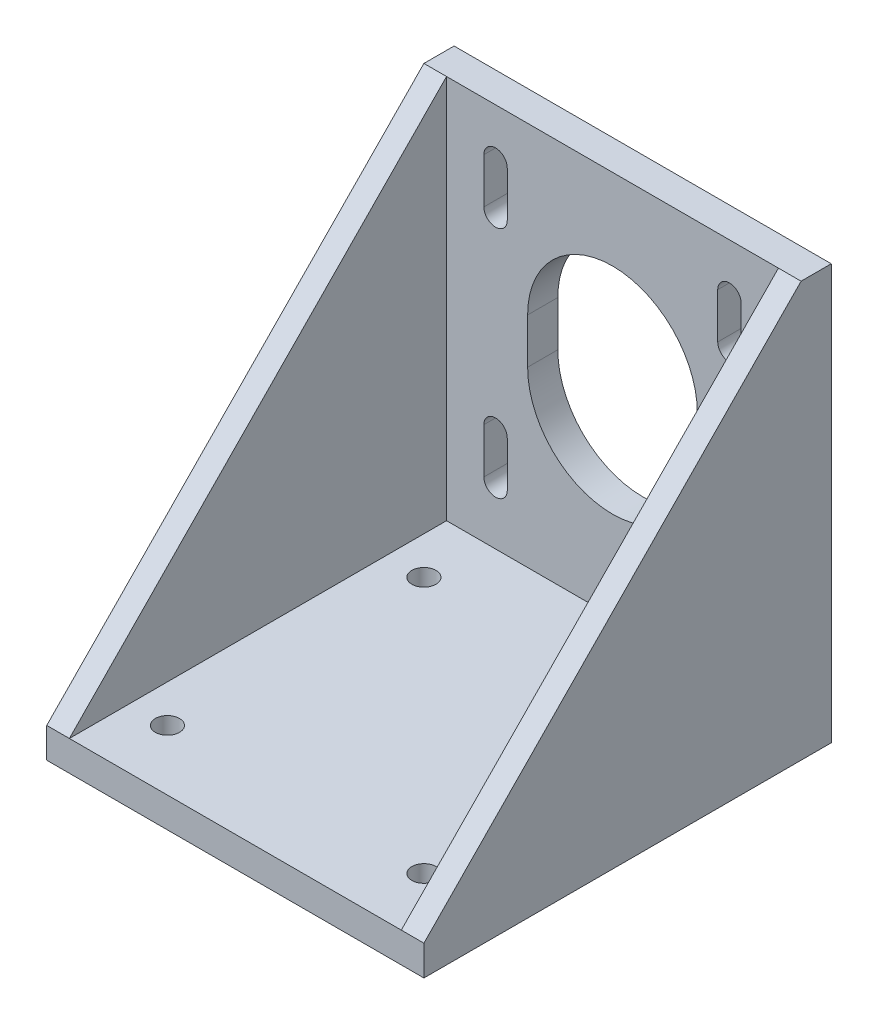
ISO-10303-21;
HEADER;
FILE_DESCRIPTION(('STEP AP214'),'2;1');
FILE_NAME('part.step','',(''),(''),'','','');
FILE_SCHEMA(('AUTOMOTIVE_DESIGN { 1 0 10303 214 1 1 1 1 }'));
ENDSEC;
DATA;
#1=APPLICATION_CONTEXT('core data for automotive mechanical design processes');
#2=APPLICATION_PROTOCOL_DEFINITION('international standard','automotive_design',2000,#1);
#3=PRODUCT_CONTEXT('',#1,'mechanical');
#4=PRODUCT('Part','Part','',(#3));
#5=PRODUCT_RELATED_PRODUCT_CATEGORY('part','',(#4));
#6=PRODUCT_DEFINITION_FORMATION('','',#4);
#7=PRODUCT_DEFINITION_CONTEXT('part definition',#1,'design');
#8=PRODUCT_DEFINITION('design','',#6,#7);
#9=PRODUCT_DEFINITION_SHAPE('','',#8);
#10=(LENGTH_UNIT() NAMED_UNIT(*) SI_UNIT(.MILLI.,.METRE.));
#11=(NAMED_UNIT(*) PLANE_ANGLE_UNIT() SI_UNIT($,.RADIAN.));
#12=(NAMED_UNIT(*) SI_UNIT($,.STERADIAN.) SOLID_ANGLE_UNIT());
#13=UNCERTAINTY_MEASURE_WITH_UNIT(LENGTH_MEASURE(1.E-05),#10,'distance_accuracy_value','');
#14=(GEOMETRIC_REPRESENTATION_CONTEXT(3) GLOBAL_UNCERTAINTY_ASSIGNED_CONTEXT((#13)) GLOBAL_UNIT_ASSIGNED_CONTEXT((#10,
#11,#12)) REPRESENTATION_CONTEXT('',''));
#15=CARTESIAN_POINT('',(0.,0.,0.));
#16=DIRECTION('',(0.,0.,1.));
#17=DIRECTION('',(1.,0.,0.));
#18=AXIS2_PLACEMENT_3D('',#15,#16,#17);
#19=CARTESIAN_POINT('',(0.,4.,0.));
#20=DIRECTION('',(0.,-1.,0.));
#21=DIRECTION('',(0.,0.,-1.));
#22=AXIS2_PLACEMENT_3D('',#19,#20,#21);
#23=PLANE('',#22);
#24=CARTESIAN_POINT('',(47.55,4.,-13.55));
#25=DIRECTION('',(0.,1.,0.));
#26=DIRECTION('',(0.,0.,1.));
#27=AXIS2_PLACEMENT_3D('',#24,#25,#26);
#28=CIRCLE('',#27,1.6);
#29=CARTESIAN_POINT('',(47.55,4.,-11.95));
#30=VERTEX_POINT('',#29);
#31=EDGE_CURVE('E450',#30,#30,#28,.T.);
#32=ORIENTED_EDGE('',*,*,#31,.F.);
#33=EDGE_LOOP('',(#32));
#34=FACE_BOUND('',#33,.T.);
#35=CARTESIAN_POINT('',(13.55,4.,-13.55));
#36=DIRECTION('',(0.,1.,0.));
#37=DIRECTION('',(0.,0.,1.));
#38=AXIS2_PLACEMENT_3D('',#35,#36,#37);
#39=CIRCLE('',#38,1.6);
#40=CARTESIAN_POINT('',(13.55,4.,-11.95));
#41=VERTEX_POINT('',#40);
#42=EDGE_CURVE('E456',#41,#41,#39,.T.);
#43=ORIENTED_EDGE('',*,*,#42,.F.);
#44=EDGE_LOOP('',(#43));
#45=FACE_BOUND('',#44,.T.);
#46=CARTESIAN_POINT('',(47.55,4.,-47.55));
#47=DIRECTION('',(0.,1.,0.));
#48=DIRECTION('',(0.,0.,1.));
#49=AXIS2_PLACEMENT_3D('',#46,#47,#48);
#50=CIRCLE('',#49,1.60000000000001);
#51=CARTESIAN_POINT('',(47.55,4.,-45.95));
#52=VERTEX_POINT('',#51);
#53=EDGE_CURVE('E462',#52,#52,#50,.T.);
#54=ORIENTED_EDGE('',*,*,#53,.F.);
#55=EDGE_LOOP('',(#54));
#56=FACE_BOUND('',#55,.T.);
#57=CARTESIAN_POINT('',(13.55,4.,-47.55));
#58=DIRECTION('',(0.,1.,0.));
#59=DIRECTION('',(0.,0.,1.));
#60=AXIS2_PLACEMENT_3D('',#57,#58,#59);
#61=CIRCLE('',#60,1.6);
#62=CARTESIAN_POINT('',(13.55,4.,-45.95));
#63=VERTEX_POINT('',#62);
#64=EDGE_CURVE('E255',#63,#63,#61,.T.);
#65=ORIENTED_EDGE('',*,*,#64,.F.);
#66=EDGE_LOOP('',(#65));
#67=FACE_BOUND('',#66,.T.);
#68=DIRECTION('',(0.,0.,1.));
#69=VECTOR('',#68,1.);
#70=CARTESIAN_POINT('',(8.55000000000001,4.,-5.54999999999999));
#71=LINE('',#70,#69);
#72=CARTESIAN_POINT('',(8.55,4.,-55.55));
#73=VERTEX_POINT('',#72);
#74=CARTESIAN_POINT('',(8.55000000000001,4.,-5.54999999999999));
#75=VERTEX_POINT('',#74);
#76=EDGE_CURVE('E221',#73,#75,#71,.T.);
#77=ORIENTED_EDGE('',*,*,#76,.T.);
#78=DIRECTION('',(1.,0.,0.));
#79=VECTOR('',#78,1.);
#80=CARTESIAN_POINT('',(5.55,4.,-5.54999999999999));
#81=LINE('',#80,#79);
#82=CARTESIAN_POINT('',(52.55,4.,-5.54999999999999));
#83=VERTEX_POINT('',#82);
#84=EDGE_CURVE('E244',#75,#83,#81,.T.);
#85=ORIENTED_EDGE('',*,*,#84,.T.);
#86=DIRECTION('',(0.,0.,-1.));
#87=VECTOR('',#86,1.);
#88=CARTESIAN_POINT('',(52.55,4.,-5.54999999999999));
#89=LINE('',#88,#87);
#90=CARTESIAN_POINT('',(52.55,4.,-55.55));
#91=VERTEX_POINT('',#90);
#92=EDGE_CURVE('E243',#83,#91,#89,.T.);
#93=ORIENTED_EDGE('',*,*,#92,.T.);
#94=DIRECTION('',(-1.,0.,0.));
#95=VECTOR('',#94,1.);
#96=CARTESIAN_POINT('',(5.55,4.,-55.55));
#97=LINE('',#96,#95);
#98=EDGE_CURVE('E236',#91,#73,#97,.T.);
#99=ORIENTED_EDGE('',*,*,#98,.T.);
#100=EDGE_LOOP('',(#77,#85,#93,#99));
#101=FACE_BOUND('',#100,.T.);
#102=ADVANCED_FACE('F35',(#34,#45,#56,#67,#101),#23,.F.);
#103=CARTESIAN_POINT('',(0.,0.,-55.55));
#104=DIRECTION('',(0.,0.,-1.));
#105=DIRECTION('',(-1.,0.,0.));
#106=AXIS2_PLACEMENT_3D('',#103,#104,#105);
#107=PLANE('',#106);
#108=CARTESIAN_POINT('',(30.55,33.,-55.55));
#109=DIRECTION('',(0.,0.,-1.));
#110=DIRECTION('',(-1.,0.,0.));
#111=AXIS2_PLACEMENT_3D('',#108,#109,#110);
#112=CIRCLE('',#111,11.25);
#113=CARTESIAN_POINT('',(19.3,33.,-55.55));
#114=VERTEX_POINT('',#113);
#115=CARTESIAN_POINT('',(41.8,33.,-55.55));
#116=VERTEX_POINT('',#115);
#117=EDGE_CURVE('E397',#114,#116,#112,.T.);
#118=ORIENTED_EDGE('',*,*,#117,.T.);
#119=DIRECTION('',(0.,-1.,0.));
#120=VECTOR('',#119,1.);
#121=CARTESIAN_POINT('',(41.8,0.,-55.55));
#122=LINE('',#121,#120);
#123=CARTESIAN_POINT('',(41.8,27.,-55.55));
#124=VERTEX_POINT('',#123);
#125=EDGE_CURVE('E280',#116,#124,#122,.T.);
#126=ORIENTED_EDGE('',*,*,#125,.T.);
#127=CARTESIAN_POINT('',(30.55,27.,-55.55));
#128=DIRECTION('',(0.,0.,-1.));
#129=DIRECTION('',(-1.,0.,0.));
#130=AXIS2_PLACEMENT_3D('',#127,#128,#129);
#131=CIRCLE('',#130,11.25);
#132=CARTESIAN_POINT('',(19.3,27.,-55.55));
#133=VERTEX_POINT('',#132);
#134=EDGE_CURVE('E283',#124,#133,#131,.T.);
#135=ORIENTED_EDGE('',*,*,#134,.T.);
#136=DIRECTION('',(0.,-1.,0.));
#137=VECTOR('',#136,1.);
#138=CARTESIAN_POINT('',(19.3,0.,-55.55));
#139=LINE('',#138,#137);
#140=EDGE_CURVE('E400',#114,#133,#139,.T.);
#141=ORIENTED_EDGE('',*,*,#140,.F.);
#142=EDGE_LOOP('',(#118,#126,#135,#141));
#143=FACE_BOUND('',#142,.T.);
#144=CARTESIAN_POINT('',(46.05,11.5,-55.55));
#145=DIRECTION('',(0.,0.,-1.));
#146=DIRECTION('',(-1.,0.,0.));
#147=AXIS2_PLACEMENT_3D('',#144,#145,#146);
#148=CIRCLE('',#147,1.55);
#149=CARTESIAN_POINT('',(47.6,11.5,-55.55));
#150=VERTEX_POINT('',#149);
#151=CARTESIAN_POINT('',(44.5,11.5,-55.55));
#152=VERTEX_POINT('',#151);
#153=EDGE_CURVE('E385',#150,#152,#148,.T.);
#154=ORIENTED_EDGE('',*,*,#153,.T.);
#155=DIRECTION('',(0.,-1.,0.));
#156=VECTOR('',#155,1.);
#157=CARTESIAN_POINT('',(44.5,0.,-55.55));
#158=LINE('',#157,#156);
#159=CARTESIAN_POINT('',(44.5,17.5,-55.55));
#160=VERTEX_POINT('',#159);
#161=EDGE_CURVE('E394',#160,#152,#158,.T.);
#162=ORIENTED_EDGE('',*,*,#161,.F.);
#163=CARTESIAN_POINT('',(46.05,17.5,-55.55));
#164=DIRECTION('',(0.,0.,-1.));
#165=DIRECTION('',(-1.,0.,0.));
#166=AXIS2_PLACEMENT_3D('',#163,#164,#165);
#167=CIRCLE('',#166,1.55);
#168=CARTESIAN_POINT('',(47.6,17.5,-55.55));
#169=VERTEX_POINT('',#168);
#170=EDGE_CURVE('E391',#160,#169,#167,.T.);
#171=ORIENTED_EDGE('',*,*,#170,.T.);
#172=DIRECTION('',(0.,-1.,0.));
#173=VECTOR('',#172,1.);
#174=CARTESIAN_POINT('',(47.6,0.,-55.55));
#175=LINE('',#174,#173);
#176=EDGE_CURVE('E388',#169,#150,#175,.T.);
#177=ORIENTED_EDGE('',*,*,#176,.T.);
#178=EDGE_LOOP('',(#154,#162,#171,#177));
#179=FACE_BOUND('',#178,.T.);
#180=CARTESIAN_POINT('',(15.05,11.5,-55.55));
#181=DIRECTION('',(0.,0.,-1.));
#182=DIRECTION('',(-1.,0.,0.));
#183=AXIS2_PLACEMENT_3D('',#180,#181,#182);
#184=CIRCLE('',#183,1.55);
#185=CARTESIAN_POINT('',(16.6,11.5,-55.55));
#186=VERTEX_POINT('',#185);
#187=CARTESIAN_POINT('',(13.5,11.5,-55.55));
#188=VERTEX_POINT('',#187);
#189=EDGE_CURVE('E373',#186,#188,#184,.T.);
#190=ORIENTED_EDGE('',*,*,#189,.T.);
#191=DIRECTION('',(0.,-1.,0.));
#192=VECTOR('',#191,1.);
#193=CARTESIAN_POINT('',(13.5,0.,-55.55));
#194=LINE('',#193,#192);
#195=CARTESIAN_POINT('',(13.5,17.5,-55.55));
#196=VERTEX_POINT('',#195);
#197=EDGE_CURVE('E382',#196,#188,#194,.T.);
#198=ORIENTED_EDGE('',*,*,#197,.F.);
#199=CARTESIAN_POINT('',(15.05,17.5,-55.55));
#200=DIRECTION('',(0.,0.,-1.));
#201=DIRECTION('',(-1.,0.,0.));
#202=AXIS2_PLACEMENT_3D('',#199,#200,#201);
#203=CIRCLE('',#202,1.55);
#204=CARTESIAN_POINT('',(16.6,17.5,-55.55));
#205=VERTEX_POINT('',#204);
#206=EDGE_CURVE('E379',#196,#205,#203,.T.);
#207=ORIENTED_EDGE('',*,*,#206,.T.);
#208=DIRECTION('',(0.,-1.,0.));
#209=VECTOR('',#208,1.);
#210=CARTESIAN_POINT('',(16.6,0.,-55.55));
#211=LINE('',#210,#209);
#212=EDGE_CURVE('E376',#205,#186,#211,.T.);
#213=ORIENTED_EDGE('',*,*,#212,.T.);
#214=EDGE_LOOP('',(#190,#198,#207,#213));
#215=FACE_BOUND('',#214,.T.);
#216=CARTESIAN_POINT('',(15.05,42.5,-55.55));
#217=DIRECTION('',(0.,0.,-1.));
#218=DIRECTION('',(-1.,0.,0.));
#219=AXIS2_PLACEMENT_3D('',#216,#217,#218);
#220=CIRCLE('',#219,1.55);
#221=CARTESIAN_POINT('',(16.6,42.5,-55.55));
#222=VERTEX_POINT('',#221);
#223=CARTESIAN_POINT('',(13.5,42.5,-55.55));
#224=VERTEX_POINT('',#223);
#225=EDGE_CURVE('E361',#222,#224,#220,.T.);
#226=ORIENTED_EDGE('',*,*,#225,.T.);
#227=DIRECTION('',(0.,-1.,0.));
#228=VECTOR('',#227,1.);
#229=CARTESIAN_POINT('',(13.5,0.,-55.55));
#230=LINE('',#229,#228);
#231=CARTESIAN_POINT('',(13.5,48.5,-55.55));
#232=VERTEX_POINT('',#231);
#233=EDGE_CURVE('E370',#232,#224,#230,.T.);
#234=ORIENTED_EDGE('',*,*,#233,.F.);
#235=CARTESIAN_POINT('',(15.05,48.5,-55.55));
#236=DIRECTION('',(0.,0.,-1.));
#237=DIRECTION('',(-1.,0.,0.));
#238=AXIS2_PLACEMENT_3D('',#235,#236,#237);
#239=CIRCLE('',#238,1.55);
#240=CARTESIAN_POINT('',(16.6,48.5,-55.55));
#241=VERTEX_POINT('',#240);
#242=EDGE_CURVE('E367',#232,#241,#239,.T.);
#243=ORIENTED_EDGE('',*,*,#242,.T.);
#244=DIRECTION('',(0.,-1.,0.));
#245=VECTOR('',#244,1.);
#246=CARTESIAN_POINT('',(16.6,0.,-55.55));
#247=LINE('',#246,#245);
#248=EDGE_CURVE('E364',#241,#222,#247,.T.);
#249=ORIENTED_EDGE('',*,*,#248,.T.);
#250=EDGE_LOOP('',(#226,#234,#243,#249));
#251=FACE_BOUND('',#250,.T.);
#252=CARTESIAN_POINT('',(46.05,42.5,-55.55));
#253=DIRECTION('',(0.,0.,-1.));
#254=DIRECTION('',(-1.,0.,0.));
#255=AXIS2_PLACEMENT_3D('',#252,#253,#254);
#256=CIRCLE('',#255,1.55);
#257=CARTESIAN_POINT('',(47.6,42.5,-55.55));
#258=VERTEX_POINT('',#257);
#259=CARTESIAN_POINT('',(44.5,42.5,-55.55));
#260=VERTEX_POINT('',#259);
#261=EDGE_CURVE('E349',#258,#260,#256,.T.);
#262=ORIENTED_EDGE('',*,*,#261,.T.);
#263=DIRECTION('',(0.,-1.,0.));
#264=VECTOR('',#263,1.);
#265=CARTESIAN_POINT('',(44.5,0.,-55.55));
#266=LINE('',#265,#264);
#267=CARTESIAN_POINT('',(44.5,48.5,-55.55));
#268=VERTEX_POINT('',#267);
#269=EDGE_CURVE('E358',#268,#260,#266,.T.);
#270=ORIENTED_EDGE('',*,*,#269,.F.);
#271=CARTESIAN_POINT('',(46.05,48.5,-55.55));
#272=DIRECTION('',(0.,0.,-1.));
#273=DIRECTION('',(-1.,0.,0.));
#274=AXIS2_PLACEMENT_3D('',#271,#272,#273);
#275=CIRCLE('',#274,1.55);
#276=CARTESIAN_POINT('',(47.6,48.5,-55.55));
#277=VERTEX_POINT('',#276);
#278=EDGE_CURVE('E355',#268,#277,#275,.T.);
#279=ORIENTED_EDGE('',*,*,#278,.T.);
#280=DIRECTION('',(0.,-1.,0.));
#281=VECTOR('',#280,1.);
#282=CARTESIAN_POINT('',(47.6,0.,-55.55));
#283=LINE('',#282,#281);
#284=EDGE_CURVE('E352',#277,#258,#283,.T.);
#285=ORIENTED_EDGE('',*,*,#284,.T.);
#286=EDGE_LOOP('',(#262,#270,#279,#285));
#287=FACE_BOUND('',#286,.T.);
#288=DIRECTION('',(0.,-1.,0.));
#289=VECTOR('',#288,1.);
#290=CARTESIAN_POINT('',(8.55,4.,-55.55));
#291=LINE('',#290,#289);
#292=CARTESIAN_POINT('',(8.55,55.,-55.55));
#293=VERTEX_POINT('',#292);
#294=EDGE_CURVE('E224',#293,#73,#291,.T.);
#295=ORIENTED_EDGE('',*,*,#294,.T.);
#296=ORIENTED_EDGE('',*,*,#98,.F.);
#297=DIRECTION('',(0.,1.,0.));
#298=VECTOR('',#297,1.);
#299=CARTESIAN_POINT('',(52.55,4.,-55.55));
#300=LINE('',#299,#298);
#301=CARTESIAN_POINT('',(52.55,55.,-55.55));
#302=VERTEX_POINT('',#301);
#303=EDGE_CURVE('E516',#91,#302,#300,.T.);
#304=ORIENTED_EDGE('',*,*,#303,.T.);
#305=DIRECTION('',(-1.,0.,0.));
#306=VECTOR('',#305,1.);
#307=CARTESIAN_POINT('',(0.,55.,-55.55));
#308=LINE('',#307,#306);
#309=EDGE_CURVE('E238',#302,#293,#308,.T.);
#310=ORIENTED_EDGE('',*,*,#309,.T.);
#311=EDGE_LOOP('',(#295,#296,#304,#310));
#312=FACE_BOUND('',#311,.T.);
#313=ADVANCED_FACE('F234',(#143,#179,#215,#251,#287,#312),#107,.F.);
#314=CARTESIAN_POINT('',(0.,0.,0.));
#315=DIRECTION('',(0.,-1.,0.));
#316=DIRECTION('',(0.,0.,-1.));
#317=AXIS2_PLACEMENT_3D('',#314,#315,#316);
#318=PLANE('',#317);
#319=CARTESIAN_POINT('',(13.55,0.,-13.55));
#320=DIRECTION('',(0.,1.,0.));
#321=DIRECTION('',(0.,0.,1.));
#322=AXIS2_PLACEMENT_3D('',#319,#320,#321);
#323=CIRCLE('',#322,1.6);
#324=CARTESIAN_POINT('',(13.55,0.,-11.95));
#325=VERTEX_POINT('',#324);
#326=EDGE_CURVE('E453',#325,#325,#323,.T.);
#327=ORIENTED_EDGE('',*,*,#326,.T.);
#328=EDGE_LOOP('',(#327));
#329=FACE_BOUND('',#328,.T.);
#330=CARTESIAN_POINT('',(13.55,0.,-47.55));
#331=DIRECTION('',(0.,1.,0.));
#332=DIRECTION('',(0.,0.,1.));
#333=AXIS2_PLACEMENT_3D('',#330,#331,#332);
#334=CIRCLE('',#333,1.6);
#335=CARTESIAN_POINT('',(13.55,0.,-45.95));
#336=VERTEX_POINT('',#335);
#337=EDGE_CURVE('E251',#336,#336,#334,.T.);
#338=ORIENTED_EDGE('',*,*,#337,.T.);
#339=EDGE_LOOP('',(#338));
#340=FACE_BOUND('',#339,.T.);
#341=DIRECTION('',(0.,0.,1.));
#342=VECTOR('',#341,1.);
#343=CARTESIAN_POINT('',(5.55,0.,-55.55));
#344=LINE('',#343,#342);
#345=CARTESIAN_POINT('',(5.55,0.,-59.55));
#346=VERTEX_POINT('',#345);
#347=CARTESIAN_POINT('',(5.55,0.,-5.54999999999999));
#348=VERTEX_POINT('',#347);
#349=EDGE_CURVE('E57',#346,#348,#344,.T.);
#350=ORIENTED_EDGE('',*,*,#349,.F.);
#351=DIRECTION('',(-1.,0.,0.));
#352=VECTOR('',#351,1.);
#353=CARTESIAN_POINT('',(0.,0.,-59.55));
#354=LINE('',#353,#352);
#355=CARTESIAN_POINT('',(55.55,0.,-59.55));
#356=VERTEX_POINT('',#355);
#357=EDGE_CURVE('E269',#356,#346,#354,.T.);
#358=ORIENTED_EDGE('',*,*,#357,.F.);
#359=DIRECTION('',(0.,0.,-1.));
#360=VECTOR('',#359,1.);
#361=CARTESIAN_POINT('',(55.55,0.,-55.55));
#362=LINE('',#361,#360);
#363=CARTESIAN_POINT('',(55.55,0.,-5.54999999999999));
#364=VERTEX_POINT('',#363);
#365=EDGE_CURVE('E245',#364,#356,#362,.T.);
#366=ORIENTED_EDGE('',*,*,#365,.F.);
#367=DIRECTION('',(1.,0.,0.));
#368=VECTOR('',#367,1.);
#369=CARTESIAN_POINT('',(5.55,0.,-5.54999999999999));
#370=LINE('',#369,#368);
#371=EDGE_CURVE('E49',#348,#364,#370,.T.);
#372=ORIENTED_EDGE('',*,*,#371,.F.);
#373=EDGE_LOOP('',(#350,#358,#366,#372));
#374=FACE_BOUND('',#373,.T.);
#375=CARTESIAN_POINT('',(47.55,0.,-47.55));
#376=DIRECTION('',(0.,1.,0.));
#377=DIRECTION('',(0.,0.,1.));
#378=AXIS2_PLACEMENT_3D('',#375,#376,#377);
#379=CIRCLE('',#378,1.60000000000001);
#380=CARTESIAN_POINT('',(47.55,0.,-45.95));
#381=VERTEX_POINT('',#380);
#382=EDGE_CURVE('E459',#381,#381,#379,.T.);
#383=ORIENTED_EDGE('',*,*,#382,.T.);
#384=EDGE_LOOP('',(#383));
#385=FACE_BOUND('',#384,.T.);
#386=CARTESIAN_POINT('',(47.55,0.,-13.55));
#387=DIRECTION('',(0.,1.,0.));
#388=DIRECTION('',(0.,0.,1.));
#389=AXIS2_PLACEMENT_3D('',#386,#387,#388);
#390=CIRCLE('',#389,1.6);
#391=CARTESIAN_POINT('',(47.55,0.,-11.95));
#392=VERTEX_POINT('',#391);
#393=EDGE_CURVE('E414',#392,#392,#390,.T.);
#394=ORIENTED_EDGE('',*,*,#393,.T.);
#395=EDGE_LOOP('',(#394));
#396=FACE_BOUND('',#395,.T.);
#397=ADVANCED_FACE('F266',(#329,#340,#374,#385,#396),#318,.T.);
#398=CARTESIAN_POINT('',(5.55,4.,-55.55));
#399=DIRECTION('',(1.,0.,0.));
#400=DIRECTION('',(0.,0.,-1.));
#401=AXIS2_PLACEMENT_3D('',#398,#399,#400);
#402=PLANE('',#401);
#403=DIRECTION('',(0.,-1.,0.));
#404=VECTOR('',#403,1.);
#405=CARTESIAN_POINT('',(5.55,4.,-5.54999999999999));
#406=LINE('',#405,#404);
#407=CARTESIAN_POINT('',(5.55,4.,-5.54999999999999));
#408=VERTEX_POINT('',#407);
#409=EDGE_CURVE('E11',#408,#348,#406,.T.);
#410=ORIENTED_EDGE('',*,*,#409,.F.);
#411=DIRECTION('',(0.,0.714072839144579,-0.700071410926058));
#412=VECTOR('',#411,1.);
#413=CARTESIAN_POINT('',(5.55,55.,-55.55));
#414=LINE('',#413,#412);
#415=CARTESIAN_POINT('',(5.55,55.,-55.55));
#416=VERTEX_POINT('',#415);
#417=EDGE_CURVE('E239',#408,#416,#414,.T.);
#418=ORIENTED_EDGE('',*,*,#417,.T.);
#419=DIRECTION('',(0.,0.,1.));
#420=VECTOR('',#419,1.);
#421=CARTESIAN_POINT('',(5.55,55.,-59.55));
#422=LINE('',#421,#420);
#423=CARTESIAN_POINT('',(5.55,55.,-59.55));
#424=VERTEX_POINT('',#423);
#425=EDGE_CURVE('E442',#424,#416,#422,.T.);
#426=ORIENTED_EDGE('',*,*,#425,.F.);
#427=DIRECTION('',(0.,1.,0.));
#428=VECTOR('',#427,1.);
#429=CARTESIAN_POINT('',(5.55,0.,-59.55));
#430=LINE('',#429,#428);
#431=EDGE_CURVE('E272',#346,#424,#430,.T.);
#432=ORIENTED_EDGE('',*,*,#431,.F.);
#433=ORIENTED_EDGE('',*,*,#349,.T.);
#434=EDGE_LOOP('',(#410,#418,#426,#432,#433));
#435=FACE_BOUND('',#434,.T.);
#436=ADVANCED_FACE('F37',(#435),#402,.F.);
#437=CARTESIAN_POINT('',(5.55,4.,-5.54999999999999));
#438=DIRECTION('',(0.,0.,-1.));
#439=DIRECTION('',(-1.,0.,0.));
#440=AXIS2_PLACEMENT_3D('',#437,#438,#439);
#441=PLANE('',#440);
#442=ORIENTED_EDGE('',*,*,#371,.T.);
#443=DIRECTION('',(0.,-1.,0.));
#444=VECTOR('',#443,1.);
#445=CARTESIAN_POINT('',(55.55,4.,-5.54999999999999));
#446=LINE('',#445,#444);
#447=CARTESIAN_POINT('',(55.55,4.,-5.54999999999999));
#448=VERTEX_POINT('',#447);
#449=EDGE_CURVE('E43',#448,#364,#446,.T.);
#450=ORIENTED_EDGE('',*,*,#449,.F.);
#451=DIRECTION('',(1.,0.,0.));
#452=VECTOR('',#451,1.);
#453=CARTESIAN_POINT('',(52.55,4.,-5.54999999999999));
#454=LINE('',#453,#452);
#455=EDGE_CURVE('E286',#83,#448,#454,.T.);
#456=ORIENTED_EDGE('',*,*,#455,.F.);
#457=ORIENTED_EDGE('',*,*,#84,.F.);
#458=EDGE_CURVE('E247',#408,#75,#81,.T.);
#459=ORIENTED_EDGE('',*,*,#458,.F.);
#460=ORIENTED_EDGE('',*,*,#409,.T.);
#461=EDGE_LOOP('',(#442,#450,#456,#457,#459,#460));
#462=FACE_BOUND('',#461,.T.);
#463=ADVANCED_FACE('F484',(#462),#441,.F.);
#464=CARTESIAN_POINT('',(55.55,4.,-55.55));
#465=DIRECTION('',(-1.,0.,0.));
#466=DIRECTION('',(0.,0.,1.));
#467=AXIS2_PLACEMENT_3D('',#464,#465,#466);
#468=PLANE('',#467);
#469=ORIENTED_EDGE('',*,*,#365,.T.);
#470=DIRECTION('',(0.,-1.,0.));
#471=VECTOR('',#470,1.);
#472=CARTESIAN_POINT('',(55.55,0.,-59.55));
#473=LINE('',#472,#471);
#474=CARTESIAN_POINT('',(55.55,55.,-59.55));
#475=VERTEX_POINT('',#474);
#476=EDGE_CURVE('E273',#475,#356,#473,.T.);
#477=ORIENTED_EDGE('',*,*,#476,.F.);
#478=DIRECTION('',(0.,0.,1.));
#479=VECTOR('',#478,1.);
#480=CARTESIAN_POINT('',(55.55,55.,-59.55));
#481=LINE('',#480,#479);
#482=CARTESIAN_POINT('',(55.55,55.,-55.55));
#483=VERTEX_POINT('',#482);
#484=EDGE_CURVE('E346',#475,#483,#481,.T.);
#485=ORIENTED_EDGE('',*,*,#484,.T.);
#486=DIRECTION('',(0.,-0.714072839144579,0.700071410926058));
#487=VECTOR('',#486,1.);
#488=CARTESIAN_POINT('',(55.55,55.,-55.55));
#489=LINE('',#488,#487);
#490=EDGE_CURVE('E263',#483,#448,#489,.T.);
#491=ORIENTED_EDGE('',*,*,#490,.T.);
#492=ORIENTED_EDGE('',*,*,#449,.T.);
#493=EDGE_LOOP('',(#469,#477,#485,#491,#492));
#494=FACE_BOUND('',#493,.T.);
#495=ADVANCED_FACE('F259',(#494),#468,.F.);
#496=CARTESIAN_POINT('',(13.55,4.,-47.55));
#497=DIRECTION('',(0.,-1.,0.));
#498=DIRECTION('',(0.,0.,-1.));
#499=AXIS2_PLACEMENT_3D('',#496,#497,#498);
#500=CYLINDRICAL_SURFACE('',#499,1.6);
#501=ORIENTED_EDGE('',*,*,#64,.T.);
#502=EDGE_LOOP('',(#501));
#503=FACE_BOUND('',#502,.T.);
#504=ORIENTED_EDGE('',*,*,#337,.F.);
#505=EDGE_LOOP('',(#504));
#506=FACE_BOUND('',#505,.T.);
#507=ADVANCED_FACE('F473',(#503,#506),#500,.F.);
#508=CARTESIAN_POINT('',(47.55,4.,-47.55));
#509=DIRECTION('',(0.,-1.,0.));
#510=DIRECTION('',(0.,0.,-1.));
#511=AXIS2_PLACEMENT_3D('',#508,#509,#510);
#512=CYLINDRICAL_SURFACE('',#511,1.60000000000001);
#513=ORIENTED_EDGE('',*,*,#53,.T.);
#514=EDGE_LOOP('',(#513));
#515=FACE_BOUND('',#514,.T.);
#516=ORIENTED_EDGE('',*,*,#382,.F.);
#517=EDGE_LOOP('',(#516));
#518=FACE_BOUND('',#517,.T.);
#519=ADVANCED_FACE('F475',(#515,#518),#512,.F.);
#520=CARTESIAN_POINT('',(13.55,4.,-13.55));
#521=DIRECTION('',(0.,-1.,0.));
#522=DIRECTION('',(0.,0.,-1.));
#523=AXIS2_PLACEMENT_3D('',#520,#521,#522);
#524=CYLINDRICAL_SURFACE('',#523,1.6);
#525=ORIENTED_EDGE('',*,*,#42,.T.);
#526=EDGE_LOOP('',(#525));
#527=FACE_BOUND('',#526,.T.);
#528=ORIENTED_EDGE('',*,*,#326,.F.);
#529=EDGE_LOOP('',(#528));
#530=FACE_BOUND('',#529,.T.);
#531=ADVANCED_FACE('F481',(#527,#530),#524,.F.);
#532=CARTESIAN_POINT('',(47.55,4.,-13.55));
#533=DIRECTION('',(0.,-1.,0.));
#534=DIRECTION('',(0.,0.,-1.));
#535=AXIS2_PLACEMENT_3D('',#532,#533,#534);
#536=CYLINDRICAL_SURFACE('',#535,1.6);
#537=ORIENTED_EDGE('',*,*,#31,.T.);
#538=EDGE_LOOP('',(#537));
#539=FACE_BOUND('',#538,.T.);
#540=ORIENTED_EDGE('',*,*,#393,.F.);
#541=EDGE_LOOP('',(#540));
#542=FACE_BOUND('',#541,.T.);
#543=ADVANCED_FACE('F546',(#539,#542),#536,.F.);
#544=CARTESIAN_POINT('',(30.55,33.,-59.55));
#545=DIRECTION('',(0.,0.,1.));
#546=DIRECTION('',(1.,0.,0.));
#547=AXIS2_PLACEMENT_3D('',#544,#545,#546);
#548=CYLINDRICAL_SURFACE('',#547,11.25);
#549=ORIENTED_EDGE('',*,*,#117,.F.);
#550=DIRECTION('',(0.,0.,1.));
#551=VECTOR('',#550,1.);
#552=CARTESIAN_POINT('',(19.3,33.,-59.55));
#553=LINE('',#552,#551);
#554=CARTESIAN_POINT('',(19.3,33.,-59.55));
#555=VERTEX_POINT('',#554);
#556=EDGE_CURVE('E412',#555,#114,#553,.T.);
#557=ORIENTED_EDGE('',*,*,#556,.F.);
#558=CARTESIAN_POINT('',(30.55,33.,-59.55));
#559=DIRECTION('',(0.,0.,-1.));
#560=DIRECTION('',(-1.,0.,0.));
#561=AXIS2_PLACEMENT_3D('',#558,#559,#560);
#562=CIRCLE('',#561,11.25);
#563=CARTESIAN_POINT('',(41.8,33.,-59.55));
#564=VERTEX_POINT('',#563);
#565=EDGE_CURVE('E335',#555,#564,#562,.T.);
#566=ORIENTED_EDGE('',*,*,#565,.T.);
#567=DIRECTION('',(0.,0.,1.));
#568=VECTOR('',#567,1.);
#569=CARTESIAN_POINT('',(41.8,33.,-59.55));
#570=LINE('',#569,#568);
#571=EDGE_CURVE('E405',#564,#116,#570,.T.);
#572=ORIENTED_EDGE('',*,*,#571,.T.);
#573=EDGE_LOOP('',(#549,#557,#566,#572));
#574=FACE_BOUND('',#573,.T.);
#575=ADVANCED_FACE('F549',(#574),#548,.F.);
#576=CARTESIAN_POINT('',(19.3,0.,-59.55));
#577=DIRECTION('',(-1.,0.,0.));
#578=DIRECTION('',(0.,0.,1.));
#579=AXIS2_PLACEMENT_3D('',#576,#577,#578);
#580=PLANE('',#579);
#581=ORIENTED_EDGE('',*,*,#140,.T.);
#582=DIRECTION('',(0.,0.,1.));
#583=VECTOR('',#582,1.);
#584=CARTESIAN_POINT('',(19.3,27.,-59.55));
#585=LINE('',#584,#583);
#586=CARTESIAN_POINT('',(19.3,27.,-59.55));
#587=VERTEX_POINT('',#586);
#588=EDGE_CURVE('E410',#587,#133,#585,.T.);
#589=ORIENTED_EDGE('',*,*,#588,.F.);
#590=DIRECTION('',(0.,-1.,0.));
#591=VECTOR('',#590,1.);
#592=CARTESIAN_POINT('',(19.3,0.,-59.55));
#593=LINE('',#592,#591);
#594=EDGE_CURVE('E338',#555,#587,#593,.T.);
#595=ORIENTED_EDGE('',*,*,#594,.F.);
#596=ORIENTED_EDGE('',*,*,#556,.T.);
#597=EDGE_LOOP('',(#581,#589,#595,#596));
#598=FACE_BOUND('',#597,.T.);
#599=ADVANCED_FACE('F579',(#598),#580,.F.);
#600=CARTESIAN_POINT('',(30.55,27.,-59.55));
#601=DIRECTION('',(0.,0.,1.));
#602=DIRECTION('',(1.,0.,0.));
#603=AXIS2_PLACEMENT_3D('',#600,#601,#602);
#604=CYLINDRICAL_SURFACE('',#603,11.25);
#605=ORIENTED_EDGE('',*,*,#134,.F.);
#606=DIRECTION('',(0.,0.,1.));
#607=VECTOR('',#606,1.);
#608=CARTESIAN_POINT('',(41.8,27.,-59.55));
#609=LINE('',#608,#607);
#610=CARTESIAN_POINT('',(41.8,27.,-59.55));
#611=VERTEX_POINT('',#610);
#612=EDGE_CURVE('E407',#611,#124,#609,.T.);
#613=ORIENTED_EDGE('',*,*,#612,.F.);
#614=CARTESIAN_POINT('',(30.55,27.,-59.55));
#615=DIRECTION('',(0.,0.,-1.));
#616=DIRECTION('',(-1.,0.,0.));
#617=AXIS2_PLACEMENT_3D('',#614,#615,#616);
#618=CIRCLE('',#617,11.25);
#619=EDGE_CURVE('E340',#611,#587,#618,.T.);
#620=ORIENTED_EDGE('',*,*,#619,.T.);
#621=ORIENTED_EDGE('',*,*,#588,.T.);
#622=EDGE_LOOP('',(#605,#613,#620,#621));
#623=FACE_BOUND('',#622,.T.);
#624=ADVANCED_FACE('F587',(#623),#604,.F.);
#625=CARTESIAN_POINT('',(46.05,11.5,-59.55));
#626=DIRECTION('',(0.,0.,1.));
#627=DIRECTION('',(1.,0.,0.));
#628=AXIS2_PLACEMENT_3D('',#625,#626,#627);
#629=CYLINDRICAL_SURFACE('',#628,1.55);
#630=ORIENTED_EDGE('',*,*,#153,.F.);
#631=DIRECTION('',(0.,0.,1.));
#632=VECTOR('',#631,1.);
#633=CARTESIAN_POINT('',(47.6,11.5,-59.55));
#634=LINE('',#633,#632);
#635=CARTESIAN_POINT('',(47.6,11.5,-59.55));
#636=VERTEX_POINT('',#635);
#637=EDGE_CURVE('E408',#636,#150,#634,.T.);
#638=ORIENTED_EDGE('',*,*,#637,.F.);
#639=CARTESIAN_POINT('',(46.05,11.5,-59.55));
#640=DIRECTION('',(0.,0.,-1.));
#641=DIRECTION('',(-1.,0.,0.));
#642=AXIS2_PLACEMENT_3D('',#639,#640,#641);
#643=CIRCLE('',#642,1.55);
#644=CARTESIAN_POINT('',(44.5,11.5,-59.55));
#645=VERTEX_POINT('',#644);
#646=EDGE_CURVE('E324',#636,#645,#643,.T.);
#647=ORIENTED_EDGE('',*,*,#646,.T.);
#648=DIRECTION('',(0.,0.,1.));
#649=VECTOR('',#648,1.);
#650=CARTESIAN_POINT('',(44.5,11.5,-59.55));
#651=LINE('',#650,#649);
#652=EDGE_CURVE('E415',#645,#152,#651,.T.);
#653=ORIENTED_EDGE('',*,*,#652,.T.);
#654=EDGE_LOOP('',(#630,#638,#647,#653));
#655=FACE_BOUND('',#654,.T.);
#656=ADVANCED_FACE('F595',(#655),#629,.F.);
#657=CARTESIAN_POINT('',(47.6,0.,-59.55));
#658=DIRECTION('',(-1.,0.,0.));
#659=DIRECTION('',(0.,0.,1.));
#660=AXIS2_PLACEMENT_3D('',#657,#658,#659);
#661=PLANE('',#660);
#662=ORIENTED_EDGE('',*,*,#176,.F.);
#663=DIRECTION('',(0.,0.,1.));
#664=VECTOR('',#663,1.);
#665=CARTESIAN_POINT('',(47.6,17.5,-59.55));
#666=LINE('',#665,#664);
#667=CARTESIAN_POINT('',(47.6,17.5,-59.55));
#668=VERTEX_POINT('',#667);
#669=EDGE_CURVE('E420',#668,#169,#666,.T.);
#670=ORIENTED_EDGE('',*,*,#669,.F.);
#671=DIRECTION('',(0.,-1.,0.));
#672=VECTOR('',#671,1.);
#673=CARTESIAN_POINT('',(47.6,0.,-59.55));
#674=LINE('',#673,#672);
#675=EDGE_CURVE('E327',#668,#636,#674,.T.);
#676=ORIENTED_EDGE('',*,*,#675,.T.);
#677=ORIENTED_EDGE('',*,*,#637,.T.);
#678=EDGE_LOOP('',(#662,#670,#676,#677));
#679=FACE_BOUND('',#678,.T.);
#680=ADVANCED_FACE('F603',(#679),#661,.T.);
#681=CARTESIAN_POINT('',(46.05,17.5,-59.55));
#682=DIRECTION('',(0.,0.,1.));
#683=DIRECTION('',(1.,0.,0.));
#684=AXIS2_PLACEMENT_3D('',#681,#682,#683);
#685=CYLINDRICAL_SURFACE('',#684,1.55);
#686=ORIENTED_EDGE('',*,*,#170,.F.);
#687=DIRECTION('',(0.,0.,1.));
#688=VECTOR('',#687,1.);
#689=CARTESIAN_POINT('',(44.5,17.5,-59.55));
#690=LINE('',#689,#688);
#691=CARTESIAN_POINT('',(44.5,17.5,-59.55));
#692=VERTEX_POINT('',#691);
#693=EDGE_CURVE('E417',#692,#160,#690,.T.);
#694=ORIENTED_EDGE('',*,*,#693,.F.);
#695=CARTESIAN_POINT('',(46.05,17.5,-59.55));
#696=DIRECTION('',(0.,0.,-1.));
#697=DIRECTION('',(-1.,0.,0.));
#698=AXIS2_PLACEMENT_3D('',#695,#696,#697);
#699=CIRCLE('',#698,1.55);
#700=EDGE_CURVE('E330',#692,#668,#699,.T.);
#701=ORIENTED_EDGE('',*,*,#700,.T.);
#702=ORIENTED_EDGE('',*,*,#669,.T.);
#703=EDGE_LOOP('',(#686,#694,#701,#702));
#704=FACE_BOUND('',#703,.T.);
#705=ADVANCED_FACE('F611',(#704),#685,.F.);
#706=CARTESIAN_POINT('',(15.05,11.5,-59.55));
#707=DIRECTION('',(0.,0.,1.));
#708=DIRECTION('',(1.,0.,0.));
#709=AXIS2_PLACEMENT_3D('',#706,#707,#708);
#710=CYLINDRICAL_SURFACE('',#709,1.55);
#711=ORIENTED_EDGE('',*,*,#189,.F.);
#712=DIRECTION('',(0.,0.,1.));
#713=VECTOR('',#712,1.);
#714=CARTESIAN_POINT('',(16.6,11.5,-59.55));
#715=LINE('',#714,#713);
#716=CARTESIAN_POINT('',(16.6,11.5,-59.55));
#717=VERTEX_POINT('',#716);
#718=EDGE_CURVE('E418',#717,#186,#715,.T.);
#719=ORIENTED_EDGE('',*,*,#718,.F.);
#720=CARTESIAN_POINT('',(15.05,11.5,-59.55));
#721=DIRECTION('',(0.,0.,-1.));
#722=DIRECTION('',(-1.,0.,0.));
#723=AXIS2_PLACEMENT_3D('',#720,#721,#722);
#724=CIRCLE('',#723,1.55);
#725=CARTESIAN_POINT('',(13.5,11.5,-59.55));
#726=VERTEX_POINT('',#725);
#727=EDGE_CURVE('E313',#717,#726,#724,.T.);
#728=ORIENTED_EDGE('',*,*,#727,.T.);
#729=DIRECTION('',(0.,0.,1.));
#730=VECTOR('',#729,1.);
#731=CARTESIAN_POINT('',(13.5,11.5,-59.55));
#732=LINE('',#731,#730);
#733=EDGE_CURVE('E423',#726,#188,#732,.T.);
#734=ORIENTED_EDGE('',*,*,#733,.T.);
#735=EDGE_LOOP('',(#711,#719,#728,#734));
#736=FACE_BOUND('',#735,.T.);
#737=ADVANCED_FACE('F619',(#736),#710,.F.);
#738=CARTESIAN_POINT('',(16.6,0.,-59.55));
#739=DIRECTION('',(-1.,0.,0.));
#740=DIRECTION('',(0.,0.,1.));
#741=AXIS2_PLACEMENT_3D('',#738,#739,#740);
#742=PLANE('',#741);
#743=ORIENTED_EDGE('',*,*,#212,.F.);
#744=DIRECTION('',(0.,0.,1.));
#745=VECTOR('',#744,1.);
#746=CARTESIAN_POINT('',(16.6,17.5,-59.55));
#747=LINE('',#746,#745);
#748=CARTESIAN_POINT('',(16.6,17.5,-59.55));
#749=VERTEX_POINT('',#748);
#750=EDGE_CURVE('E428',#749,#205,#747,.T.);
#751=ORIENTED_EDGE('',*,*,#750,.F.);
#752=DIRECTION('',(0.,-1.,0.));
#753=VECTOR('',#752,1.);
#754=CARTESIAN_POINT('',(16.6,0.,-59.55));
#755=LINE('',#754,#753);
#756=EDGE_CURVE('E316',#749,#717,#755,.T.);
#757=ORIENTED_EDGE('',*,*,#756,.T.);
#758=ORIENTED_EDGE('',*,*,#718,.T.);
#759=EDGE_LOOP('',(#743,#751,#757,#758));
#760=FACE_BOUND('',#759,.T.);
#761=ADVANCED_FACE('F627',(#760),#742,.T.);
#762=CARTESIAN_POINT('',(15.05,17.5,-59.55));
#763=DIRECTION('',(0.,0.,1.));
#764=DIRECTION('',(1.,0.,0.));
#765=AXIS2_PLACEMENT_3D('',#762,#763,#764);
#766=CYLINDRICAL_SURFACE('',#765,1.55);
#767=ORIENTED_EDGE('',*,*,#206,.F.);
#768=DIRECTION('',(0.,0.,1.));
#769=VECTOR('',#768,1.);
#770=CARTESIAN_POINT('',(13.5,17.5,-59.55));
#771=LINE('',#770,#769);
#772=CARTESIAN_POINT('',(13.5,17.5,-59.55));
#773=VERTEX_POINT('',#772);
#774=EDGE_CURVE('E425',#773,#196,#771,.T.);
#775=ORIENTED_EDGE('',*,*,#774,.F.);
#776=CARTESIAN_POINT('',(15.05,17.5,-59.55));
#777=DIRECTION('',(0.,0.,-1.));
#778=DIRECTION('',(-1.,0.,0.));
#779=AXIS2_PLACEMENT_3D('',#776,#777,#778);
#780=CIRCLE('',#779,1.55);
#781=EDGE_CURVE('E319',#773,#749,#780,.T.);
#782=ORIENTED_EDGE('',*,*,#781,.T.);
#783=ORIENTED_EDGE('',*,*,#750,.T.);
#784=EDGE_LOOP('',(#767,#775,#782,#783));
#785=FACE_BOUND('',#784,.T.);
#786=ADVANCED_FACE('F635',(#785),#766,.F.);
#787=CARTESIAN_POINT('',(15.05,42.5,-59.55));
#788=DIRECTION('',(0.,0.,1.));
#789=DIRECTION('',(1.,0.,0.));
#790=AXIS2_PLACEMENT_3D('',#787,#788,#789);
#791=CYLINDRICAL_SURFACE('',#790,1.55);
#792=ORIENTED_EDGE('',*,*,#225,.F.);
#793=DIRECTION('',(0.,0.,1.));
#794=VECTOR('',#793,1.);
#795=CARTESIAN_POINT('',(16.6,42.5,-59.55));
#796=LINE('',#795,#794);
#797=CARTESIAN_POINT('',(16.6,42.5,-59.55));
#798=VERTEX_POINT('',#797);
#799=EDGE_CURVE('E426',#798,#222,#796,.T.);
#800=ORIENTED_EDGE('',*,*,#799,.F.);
#801=CARTESIAN_POINT('',(15.05,42.5,-59.55));
#802=DIRECTION('',(0.,0.,-1.));
#803=DIRECTION('',(-1.,0.,0.));
#804=AXIS2_PLACEMENT_3D('',#801,#802,#803);
#805=CIRCLE('',#804,1.55);
#806=CARTESIAN_POINT('',(13.5,42.5,-59.55));
#807=VERTEX_POINT('',#806);
#808=EDGE_CURVE('E302',#798,#807,#805,.T.);
#809=ORIENTED_EDGE('',*,*,#808,.T.);
#810=DIRECTION('',(0.,0.,1.));
#811=VECTOR('',#810,1.);
#812=CARTESIAN_POINT('',(13.5,42.5,-59.55));
#813=LINE('',#812,#811);
#814=EDGE_CURVE('E431',#807,#224,#813,.T.);
#815=ORIENTED_EDGE('',*,*,#814,.T.);
#816=EDGE_LOOP('',(#792,#800,#809,#815));
#817=FACE_BOUND('',#816,.T.);
#818=ADVANCED_FACE('F643',(#817),#791,.F.);
#819=CARTESIAN_POINT('',(16.6,0.,-59.55));
#820=DIRECTION('',(-1.,0.,0.));
#821=DIRECTION('',(0.,0.,1.));
#822=AXIS2_PLACEMENT_3D('',#819,#820,#821);
#823=PLANE('',#822);
#824=ORIENTED_EDGE('',*,*,#248,.F.);
#825=DIRECTION('',(0.,0.,1.));
#826=VECTOR('',#825,1.);
#827=CARTESIAN_POINT('',(16.6,48.5,-59.55));
#828=LINE('',#827,#826);
#829=CARTESIAN_POINT('',(16.6,48.5,-59.55));
#830=VERTEX_POINT('',#829);
#831=EDGE_CURVE('E436',#830,#241,#828,.T.);
#832=ORIENTED_EDGE('',*,*,#831,.F.);
#833=DIRECTION('',(0.,-1.,0.));
#834=VECTOR('',#833,1.);
#835=CARTESIAN_POINT('',(16.6,0.,-59.55));
#836=LINE('',#835,#834);
#837=EDGE_CURVE('E305',#830,#798,#836,.T.);
#838=ORIENTED_EDGE('',*,*,#837,.T.);
#839=ORIENTED_EDGE('',*,*,#799,.T.);
#840=EDGE_LOOP('',(#824,#832,#838,#839));
#841=FACE_BOUND('',#840,.T.);
#842=ADVANCED_FACE('F651',(#841),#823,.T.);
#843=CARTESIAN_POINT('',(15.05,48.5,-59.55));
#844=DIRECTION('',(0.,0.,1.));
#845=DIRECTION('',(1.,0.,0.));
#846=AXIS2_PLACEMENT_3D('',#843,#844,#845);
#847=CYLINDRICAL_SURFACE('',#846,1.55);
#848=ORIENTED_EDGE('',*,*,#242,.F.);
#849=DIRECTION('',(0.,0.,1.));
#850=VECTOR('',#849,1.);
#851=CARTESIAN_POINT('',(13.5,48.5,-59.55));
#852=LINE('',#851,#850);
#853=CARTESIAN_POINT('',(13.5,48.5,-59.55));
#854=VERTEX_POINT('',#853);
#855=EDGE_CURVE('E433',#854,#232,#852,.T.);
#856=ORIENTED_EDGE('',*,*,#855,.F.);
#857=CARTESIAN_POINT('',(15.05,48.5,-59.55));
#858=DIRECTION('',(0.,0.,-1.));
#859=DIRECTION('',(-1.,0.,0.));
#860=AXIS2_PLACEMENT_3D('',#857,#858,#859);
#861=CIRCLE('',#860,1.55);
#862=EDGE_CURVE('E308',#854,#830,#861,.T.);
#863=ORIENTED_EDGE('',*,*,#862,.T.);
#864=ORIENTED_EDGE('',*,*,#831,.T.);
#865=EDGE_LOOP('',(#848,#856,#863,#864));
#866=FACE_BOUND('',#865,.T.);
#867=ADVANCED_FACE('F659',(#866),#847,.F.);
#868=CARTESIAN_POINT('',(46.05,42.5,-59.55));
#869=DIRECTION('',(0.,0.,1.));
#870=DIRECTION('',(1.,0.,0.));
#871=AXIS2_PLACEMENT_3D('',#868,#869,#870);
#872=CYLINDRICAL_SURFACE('',#871,1.55);
#873=ORIENTED_EDGE('',*,*,#261,.F.);
#874=DIRECTION('',(0.,0.,1.));
#875=VECTOR('',#874,1.);
#876=CARTESIAN_POINT('',(47.6,42.5,-59.55));
#877=LINE('',#876,#875);
#878=CARTESIAN_POINT('',(47.6,42.5,-59.55));
#879=VERTEX_POINT('',#878);
#880=EDGE_CURVE('E434',#879,#258,#877,.T.);
#881=ORIENTED_EDGE('',*,*,#880,.F.);
#882=CARTESIAN_POINT('',(46.05,42.5,-59.55));
#883=DIRECTION('',(0.,0.,-1.));
#884=DIRECTION('',(-1.,0.,0.));
#885=AXIS2_PLACEMENT_3D('',#882,#883,#884);
#886=CIRCLE('',#885,1.55);
#887=CARTESIAN_POINT('',(44.5,42.5,-59.55));
#888=VERTEX_POINT('',#887);
#889=EDGE_CURVE('E291',#879,#888,#886,.T.);
#890=ORIENTED_EDGE('',*,*,#889,.T.);
#891=DIRECTION('',(0.,0.,1.));
#892=VECTOR('',#891,1.);
#893=CARTESIAN_POINT('',(44.5,42.5,-59.55));
#894=LINE('',#893,#892);
#895=EDGE_CURVE('E439',#888,#260,#894,.T.);
#896=ORIENTED_EDGE('',*,*,#895,.T.);
#897=EDGE_LOOP('',(#873,#881,#890,#896));
#898=FACE_BOUND('',#897,.T.);
#899=ADVANCED_FACE('F544',(#898),#872,.F.);
#900=CARTESIAN_POINT('',(47.6,0.,-59.55));
#901=DIRECTION('',(-1.,0.,0.));
#902=DIRECTION('',(0.,0.,1.));
#903=AXIS2_PLACEMENT_3D('',#900,#901,#902);
#904=PLANE('',#903);
#905=ORIENTED_EDGE('',*,*,#284,.F.);
#906=DIRECTION('',(0.,0.,1.));
#907=VECTOR('',#906,1.);
#908=CARTESIAN_POINT('',(47.6,48.5,-59.55));
#909=LINE('',#908,#907);
#910=CARTESIAN_POINT('',(47.6,48.5,-59.55));
#911=VERTEX_POINT('',#910);
#912=EDGE_CURVE('E444',#911,#277,#909,.T.);
#913=ORIENTED_EDGE('',*,*,#912,.F.);
#914=DIRECTION('',(0.,-1.,0.));
#915=VECTOR('',#914,1.);
#916=CARTESIAN_POINT('',(47.6,0.,-59.55));
#917=LINE('',#916,#915);
#918=EDGE_CURVE('E294',#911,#879,#917,.T.);
#919=ORIENTED_EDGE('',*,*,#918,.T.);
#920=ORIENTED_EDGE('',*,*,#880,.T.);
#921=EDGE_LOOP('',(#905,#913,#919,#920));
#922=FACE_BOUND('',#921,.T.);
#923=ADVANCED_FACE('F674',(#922),#904,.T.);
#924=CARTESIAN_POINT('',(46.05,48.5,-59.55));
#925=DIRECTION('',(0.,0.,1.));
#926=DIRECTION('',(1.,0.,0.));
#927=AXIS2_PLACEMENT_3D('',#924,#925,#926);
#928=CYLINDRICAL_SURFACE('',#927,1.55);
#929=ORIENTED_EDGE('',*,*,#278,.F.);
#930=DIRECTION('',(0.,0.,1.));
#931=VECTOR('',#930,1.);
#932=CARTESIAN_POINT('',(44.5,48.5,-59.55));
#933=LINE('',#932,#931);
#934=CARTESIAN_POINT('',(44.5,48.5,-59.55));
#935=VERTEX_POINT('',#934);
#936=EDGE_CURVE('E441',#935,#268,#933,.T.);
#937=ORIENTED_EDGE('',*,*,#936,.F.);
#938=CARTESIAN_POINT('',(46.05,48.5,-59.55));
#939=DIRECTION('',(0.,0.,-1.));
#940=DIRECTION('',(-1.,0.,0.));
#941=AXIS2_PLACEMENT_3D('',#938,#939,#940);
#942=CIRCLE('',#941,1.55);
#943=EDGE_CURVE('E297',#935,#911,#942,.T.);
#944=ORIENTED_EDGE('',*,*,#943,.T.);
#945=ORIENTED_EDGE('',*,*,#912,.T.);
#946=EDGE_LOOP('',(#929,#937,#944,#945));
#947=FACE_BOUND('',#946,.T.);
#948=ADVANCED_FACE('F681',(#947),#928,.F.);
#949=CARTESIAN_POINT('',(44.5,0.,-59.55));
#950=DIRECTION('',(-1.,0.,0.));
#951=DIRECTION('',(0.,0.,1.));
#952=AXIS2_PLACEMENT_3D('',#949,#950,#951);
#953=PLANE('',#952);
#954=ORIENTED_EDGE('',*,*,#161,.T.);
#955=ORIENTED_EDGE('',*,*,#652,.F.);
#956=DIRECTION('',(0.,-1.,0.));
#957=VECTOR('',#956,1.);
#958=CARTESIAN_POINT('',(44.5,0.,-59.55));
#959=LINE('',#958,#957);
#960=EDGE_CURVE('E333',#692,#645,#959,.T.);
#961=ORIENTED_EDGE('',*,*,#960,.F.);
#962=ORIENTED_EDGE('',*,*,#693,.T.);
#963=EDGE_LOOP('',(#954,#955,#961,#962));
#964=FACE_BOUND('',#963,.T.);
#965=ADVANCED_FACE('F688',(#964),#953,.F.);
#966=CARTESIAN_POINT('',(13.5,0.,-59.55));
#967=DIRECTION('',(-1.,0.,0.));
#968=DIRECTION('',(0.,0.,1.));
#969=AXIS2_PLACEMENT_3D('',#966,#967,#968);
#970=PLANE('',#969);
#971=ORIENTED_EDGE('',*,*,#197,.T.);
#972=ORIENTED_EDGE('',*,*,#733,.F.);
#973=DIRECTION('',(0.,-1.,0.));
#974=VECTOR('',#973,1.);
#975=CARTESIAN_POINT('',(13.5,0.,-59.55));
#976=LINE('',#975,#974);
#977=EDGE_CURVE('E322',#773,#726,#976,.T.);
#978=ORIENTED_EDGE('',*,*,#977,.F.);
#979=ORIENTED_EDGE('',*,*,#774,.T.);
#980=EDGE_LOOP('',(#971,#972,#978,#979));
#981=FACE_BOUND('',#980,.T.);
#982=ADVANCED_FACE('F696',(#981),#970,.F.);
#983=CARTESIAN_POINT('',(13.5,0.,-59.55));
#984=DIRECTION('',(-1.,0.,0.));
#985=DIRECTION('',(0.,0.,1.));
#986=AXIS2_PLACEMENT_3D('',#983,#984,#985);
#987=PLANE('',#986);
#988=ORIENTED_EDGE('',*,*,#233,.T.);
#989=ORIENTED_EDGE('',*,*,#814,.F.);
#990=DIRECTION('',(0.,-1.,0.));
#991=VECTOR('',#990,1.);
#992=CARTESIAN_POINT('',(13.5,0.,-59.55));
#993=LINE('',#992,#991);
#994=EDGE_CURVE('E311',#854,#807,#993,.T.);
#995=ORIENTED_EDGE('',*,*,#994,.F.);
#996=ORIENTED_EDGE('',*,*,#855,.T.);
#997=EDGE_LOOP('',(#988,#989,#995,#996));
#998=FACE_BOUND('',#997,.T.);
#999=ADVANCED_FACE('F539',(#998),#987,.F.);
#1000=CARTESIAN_POINT('',(44.5,0.,-59.55));
#1001=DIRECTION('',(-1.,0.,0.));
#1002=DIRECTION('',(0.,0.,1.));
#1003=AXIS2_PLACEMENT_3D('',#1000,#1001,#1002);
#1004=PLANE('',#1003);
#1005=ORIENTED_EDGE('',*,*,#269,.T.);
#1006=ORIENTED_EDGE('',*,*,#895,.F.);
#1007=DIRECTION('',(0.,-1.,0.));
#1008=VECTOR('',#1007,1.);
#1009=CARTESIAN_POINT('',(44.5,0.,-59.55));
#1010=LINE('',#1009,#1008);
#1011=EDGE_CURVE('E300',#935,#888,#1010,.T.);
#1012=ORIENTED_EDGE('',*,*,#1011,.F.);
#1013=ORIENTED_EDGE('',*,*,#936,.T.);
#1014=EDGE_LOOP('',(#1005,#1006,#1012,#1013));
#1015=FACE_BOUND('',#1014,.T.);
#1016=ADVANCED_FACE('F531',(#1015),#1004,.F.);
#1017=CARTESIAN_POINT('',(0.,55.,-59.55));
#1018=DIRECTION('',(0.,1.,0.));
#1019=DIRECTION('',(0.,0.,1.));
#1020=AXIS2_PLACEMENT_3D('',#1017,#1018,#1019);
#1021=PLANE('',#1020);
#1022=EDGE_CURVE('E347',#483,#302,#308,.T.);
#1023=ORIENTED_EDGE('',*,*,#1022,.F.);
#1024=ORIENTED_EDGE('',*,*,#484,.F.);
#1025=DIRECTION('',(-1.,0.,0.));
#1026=VECTOR('',#1025,1.);
#1027=CARTESIAN_POINT('',(0.,55.,-59.55));
#1028=LINE('',#1027,#1026);
#1029=EDGE_CURVE('E279',#475,#424,#1028,.T.);
#1030=ORIENTED_EDGE('',*,*,#1029,.T.);
#1031=ORIENTED_EDGE('',*,*,#425,.T.);
#1032=DIRECTION('',(-1.,0.,0.));
#1033=VECTOR('',#1032,1.);
#1034=CARTESIAN_POINT('',(8.55,55.,-55.55));
#1035=LINE('',#1034,#1033);
#1036=EDGE_CURVE('E511',#293,#416,#1035,.T.);
#1037=ORIENTED_EDGE('',*,*,#1036,.F.);
#1038=ORIENTED_EDGE('',*,*,#309,.F.);
#1039=EDGE_LOOP('',(#1023,#1024,#1030,#1031,#1037,#1038));
#1040=FACE_BOUND('',#1039,.T.);
#1041=ADVANCED_FACE('F528',(#1040),#1021,.T.);
#1042=CARTESIAN_POINT('',(41.8,0.,-59.55));
#1043=DIRECTION('',(-1.,0.,0.));
#1044=DIRECTION('',(0.,0.,1.));
#1045=AXIS2_PLACEMENT_3D('',#1042,#1043,#1044);
#1046=PLANE('',#1045);
#1047=ORIENTED_EDGE('',*,*,#125,.F.);
#1048=ORIENTED_EDGE('',*,*,#571,.F.);
#1049=DIRECTION('',(0.,-1.,0.));
#1050=VECTOR('',#1049,1.);
#1051=CARTESIAN_POINT('',(41.8,0.,-59.55));
#1052=LINE('',#1051,#1050);
#1053=EDGE_CURVE('E343',#564,#611,#1052,.T.);
#1054=ORIENTED_EDGE('',*,*,#1053,.T.);
#1055=ORIENTED_EDGE('',*,*,#612,.T.);
#1056=EDGE_LOOP('',(#1047,#1048,#1054,#1055));
#1057=FACE_BOUND('',#1056,.T.);
#1058=ADVANCED_FACE('F530',(#1057),#1046,.T.);
#1059=CARTESIAN_POINT('',(0.,0.,-59.55));
#1060=DIRECTION('',(0.,0.,-1.));
#1061=DIRECTION('',(-1.,0.,0.));
#1062=AXIS2_PLACEMENT_3D('',#1059,#1060,#1061);
#1063=PLANE('',#1062);
#1064=ORIENTED_EDGE('',*,*,#476,.T.);
#1065=ORIENTED_EDGE('',*,*,#357,.T.);
#1066=ORIENTED_EDGE('',*,*,#431,.T.);
#1067=ORIENTED_EDGE('',*,*,#1029,.F.);
#1068=EDGE_LOOP('',(#1064,#1065,#1066,#1067));
#1069=FACE_BOUND('',#1068,.T.);
#1070=ORIENTED_EDGE('',*,*,#889,.F.);
#1071=ORIENTED_EDGE('',*,*,#918,.F.);
#1072=ORIENTED_EDGE('',*,*,#943,.F.);
#1073=ORIENTED_EDGE('',*,*,#1011,.T.);
#1074=EDGE_LOOP('',(#1070,#1071,#1072,#1073));
#1075=FACE_BOUND('',#1074,.T.);
#1076=ORIENTED_EDGE('',*,*,#808,.F.);
#1077=ORIENTED_EDGE('',*,*,#837,.F.);
#1078=ORIENTED_EDGE('',*,*,#862,.F.);
#1079=ORIENTED_EDGE('',*,*,#994,.T.);
#1080=EDGE_LOOP('',(#1076,#1077,#1078,#1079));
#1081=FACE_BOUND('',#1080,.T.);
#1082=ORIENTED_EDGE('',*,*,#727,.F.);
#1083=ORIENTED_EDGE('',*,*,#756,.F.);
#1084=ORIENTED_EDGE('',*,*,#781,.F.);
#1085=ORIENTED_EDGE('',*,*,#977,.T.);
#1086=EDGE_LOOP('',(#1082,#1083,#1084,#1085));
#1087=FACE_BOUND('',#1086,.T.);
#1088=ORIENTED_EDGE('',*,*,#646,.F.);
#1089=ORIENTED_EDGE('',*,*,#675,.F.);
#1090=ORIENTED_EDGE('',*,*,#700,.F.);
#1091=ORIENTED_EDGE('',*,*,#960,.T.);
#1092=EDGE_LOOP('',(#1088,#1089,#1090,#1091));
#1093=FACE_BOUND('',#1092,.T.);
#1094=ORIENTED_EDGE('',*,*,#565,.F.);
#1095=ORIENTED_EDGE('',*,*,#594,.T.);
#1096=ORIENTED_EDGE('',*,*,#619,.F.);
#1097=ORIENTED_EDGE('',*,*,#1053,.F.);
#1098=EDGE_LOOP('',(#1094,#1095,#1096,#1097));
#1099=FACE_BOUND('',#1098,.T.);
#1100=ADVANCED_FACE('F276',(#1069,#1075,#1081,#1087,#1093,#1099),#1063,.T.);
#1101=CARTESIAN_POINT('',(52.55,55.,-55.55));
#1102=DIRECTION('',(0.,0.700071410926058,0.714072839144579));
#1103=DIRECTION('',(0.,-0.714072839144579,0.700071410926058));
#1104=AXIS2_PLACEMENT_3D('',#1101,#1102,#1103);
#1105=PLANE('',#1104);
#1106=ORIENTED_EDGE('',*,*,#490,.F.);
#1107=ORIENTED_EDGE('',*,*,#1022,.T.);
#1108=DIRECTION('',(0.,-0.714072839144579,0.700071410926058));
#1109=VECTOR('',#1108,1.);
#1110=CARTESIAN_POINT('',(52.55,55.,-55.55));
#1111=LINE('',#1110,#1109);
#1112=EDGE_CURVE('E518',#302,#83,#1111,.T.);
#1113=ORIENTED_EDGE('',*,*,#1112,.T.);
#1114=ORIENTED_EDGE('',*,*,#455,.T.);
#1115=EDGE_LOOP('',(#1106,#1107,#1113,#1114));
#1116=FACE_BOUND('',#1115,.T.);
#1117=ADVANCED_FACE('F522',(#1116),#1105,.T.);
#1118=CARTESIAN_POINT('',(52.55,0.,0.));
#1119=DIRECTION('',(-1.,0.,0.));
#1120=DIRECTION('',(0.,0.,1.));
#1121=AXIS2_PLACEMENT_3D('',#1118,#1119,#1120);
#1122=PLANE('',#1121);
#1123=ORIENTED_EDGE('',*,*,#303,.F.);
#1124=ORIENTED_EDGE('',*,*,#92,.F.);
#1125=ORIENTED_EDGE('',*,*,#1112,.F.);
#1126=EDGE_LOOP('',(#1123,#1124,#1125));
#1127=FACE_BOUND('',#1126,.T.);
#1128=ADVANCED_FACE('F526',(#1127),#1122,.T.);
#1129=CARTESIAN_POINT('',(8.55,55.,-55.55));
#1130=DIRECTION('',(0.,0.700071410926058,0.714072839144578));
#1131=DIRECTION('',(0.,-0.714072839144579,0.700071410926058));
#1132=AXIS2_PLACEMENT_3D('',#1129,#1130,#1131);
#1133=PLANE('',#1132);
#1134=ORIENTED_EDGE('',*,*,#417,.F.);
#1135=ORIENTED_EDGE('',*,*,#458,.T.);
#1136=DIRECTION('',(0.,0.714072839144579,-0.700071410926058));
#1137=VECTOR('',#1136,1.);
#1138=CARTESIAN_POINT('',(8.55,55.,-55.55));
#1139=LINE('',#1138,#1137);
#1140=EDGE_CURVE('E226',#75,#293,#1139,.T.);
#1141=ORIENTED_EDGE('',*,*,#1140,.T.);
#1142=ORIENTED_EDGE('',*,*,#1036,.T.);
#1143=EDGE_LOOP('',(#1134,#1135,#1141,#1142));
#1144=FACE_BOUND('',#1143,.T.);
#1145=ADVANCED_FACE('F509',(#1144),#1133,.T.);
#1146=CARTESIAN_POINT('',(8.55000000000001,0.,0.));
#1147=DIRECTION('',(-1.,0.,0.));
#1148=DIRECTION('',(0.,0.,1.));
#1149=AXIS2_PLACEMENT_3D('',#1146,#1147,#1148);
#1150=PLANE('',#1149);
#1151=ORIENTED_EDGE('',*,*,#294,.F.);
#1152=ORIENTED_EDGE('',*,*,#1140,.F.);
#1153=ORIENTED_EDGE('',*,*,#76,.F.);
#1154=EDGE_LOOP('',(#1151,#1152,#1153));
#1155=FACE_BOUND('',#1154,.T.);
#1156=ADVANCED_FACE('F223',(#1155),#1150,.F.);
#1157=CLOSED_SHELL('',(#102,#313,#397,#436,#463,#495,#507,#519,#531,#543,#575,#599,#624,#656,
#680,#705,#737,#761,#786,#818,#842,#867,#899,#923,#948,#965,#982,#999,#1016,#1041,#1058,#1100,
#1117,#1128,#1145,#1156));
#1158=MANIFOLD_SOLID_BREP('B2',#1157);
#1159=ADVANCED_BREP_SHAPE_REPRESENTATION('',(#18,#1158),#14);
#1160=SHAPE_DEFINITION_REPRESENTATION(#9,#1159);
ENDSEC;
END-ISO-10303-21;
